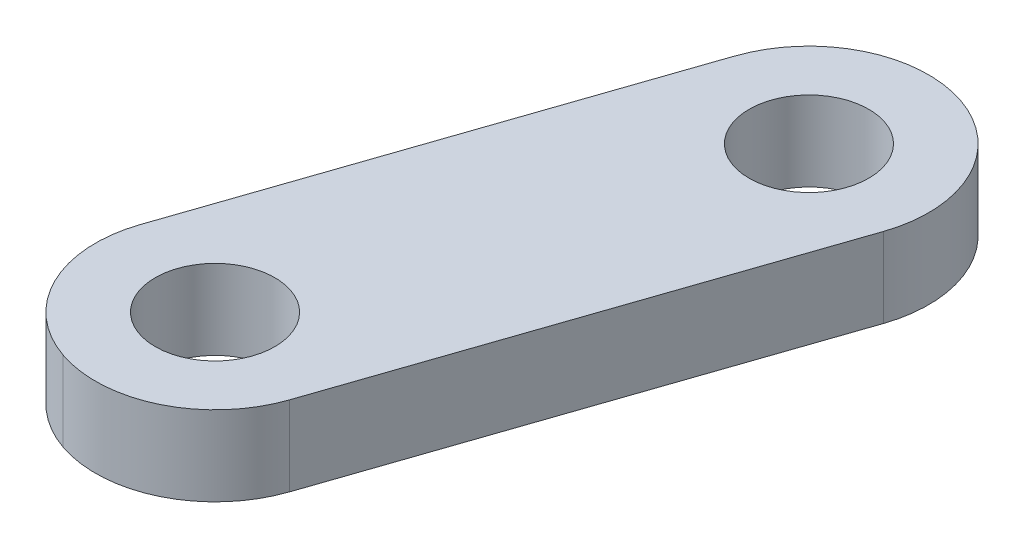
ISO-10303-21;
HEADER;
FILE_DESCRIPTION(('STEP AP214'),'2;1');
FILE_NAME('part.step','',(''),(''),'','','');
FILE_SCHEMA(('AUTOMOTIVE_DESIGN { 1 0 10303 214 1 1 1 1 }'));
ENDSEC;
DATA;
#1=APPLICATION_CONTEXT('core data for automotive mechanical design processes');
#2=APPLICATION_PROTOCOL_DEFINITION('international standard','automotive_design',2000,#1);
#3=PRODUCT_CONTEXT('',#1,'mechanical');
#4=PRODUCT('Part','Part','',(#3));
#5=PRODUCT_RELATED_PRODUCT_CATEGORY('part','',(#4));
#6=PRODUCT_DEFINITION_FORMATION('','',#4);
#7=PRODUCT_DEFINITION_CONTEXT('part definition',#1,'design');
#8=PRODUCT_DEFINITION('design','',#6,#7);
#9=PRODUCT_DEFINITION_SHAPE('','',#8);
#10=(LENGTH_UNIT() NAMED_UNIT(*) SI_UNIT(.MILLI.,.METRE.));
#11=(NAMED_UNIT(*) PLANE_ANGLE_UNIT() SI_UNIT($,.RADIAN.));
#12=(NAMED_UNIT(*) SI_UNIT($,.STERADIAN.) SOLID_ANGLE_UNIT());
#13=UNCERTAINTY_MEASURE_WITH_UNIT(LENGTH_MEASURE(1.E-05),#10,'distance_accuracy_value','');
#14=(GEOMETRIC_REPRESENTATION_CONTEXT(3) GLOBAL_UNCERTAINTY_ASSIGNED_CONTEXT((#13)) GLOBAL_UNIT_ASSIGNED_CONTEXT((#10,
#11,#12)) REPRESENTATION_CONTEXT('',''));
#15=CARTESIAN_POINT('',(0.,0.,0.));
#16=DIRECTION('',(0.,0.,1.));
#17=DIRECTION('',(1.,0.,0.));
#18=AXIS2_PLACEMENT_3D('',#15,#16,#17);
#19=CARTESIAN_POINT('',(0.,6.35,0.));
#20=DIRECTION('',(0.,1.,0.));
#21=DIRECTION('',(0.,0.,1.));
#22=AXIS2_PLACEMENT_3D('',#19,#20,#21);
#23=PLANE('',#22);
#24=CARTESIAN_POINT('',(166.123917666113,6.35,61.1988351462865));
#25=DIRECTION('',(0.,1.,0.));
#26=DIRECTION('',(0.,0.,1.));
#27=AXIS2_PLACEMENT_3D('',#24,#25,#26);
#28=CIRCLE('',#27,4.76250000000001);
#29=CARTESIAN_POINT('',(166.123917666113,6.35,65.9613351462865));
#30=VERTEX_POINT('',#29);
#31=EDGE_CURVE('E124',#30,#30,#28,.T.);
#32=ORIENTED_EDGE('',*,*,#31,.F.);
#33=EDGE_LOOP('',(#32));
#34=FACE_BOUND('',#33,.T.);
#35=CARTESIAN_POINT('',(154.091290271028,6.35,96.4608504327486));
#36=DIRECTION('',(0.,1.,0.));
#37=DIRECTION('',(0.,0.,1.));
#38=AXIS2_PLACEMENT_3D('',#35,#36,#37);
#39=CIRCLE('',#38,9.525);
#40=CARTESIAN_POINT('',(145.076677903134,6.35,93.3847508152761));
#41=VERTEX_POINT('',#40);
#42=CARTESIAN_POINT('',(151.015190653556,6.35,105.475462800643));
#43=VERTEX_POINT('',#42);
#44=EDGE_CURVE('E56',#41,#43,#39,.T.);
#45=ORIENTED_EDGE('',*,*,#44,.T.);
#46=CARTESIAN_POINT('',(154.091290271028,6.35,96.4608504327486));
#47=DIRECTION('',(0.,1.,0.));
#48=DIRECTION('',(0.,0.,1.));
#49=AXIS2_PLACEMENT_3D('',#46,#47,#48);
#50=CIRCLE('',#49,9.525);
#51=CARTESIAN_POINT('',(163.105902638922,6.35,99.5369500502211));
#52=VERTEX_POINT('',#51);
#53=EDGE_CURVE('E137',#43,#52,#50,.T.);
#54=ORIENTED_EDGE('',*,*,#53,.T.);
#55=DIRECTION('',(0.32295009107323,0.,-0.94641599662928));
#56=VECTOR('',#55,1.);
#57=CARTESIAN_POINT('',(178.21462965148,6.35,55.2603223958651));
#58=LINE('',#57,#56);
#59=CARTESIAN_POINT('',(175.138530034007,6.35,64.274934763759));
#60=VERTEX_POINT('',#59);
#61=EDGE_CURVE('E113',#52,#60,#58,.T.);
#62=ORIENTED_EDGE('',*,*,#61,.T.);
#63=CARTESIAN_POINT('',(166.123917666114,6.35,61.1988351462865));
#64=DIRECTION('',(0.,1.,0.));
#65=DIRECTION('',(0.,0.,1.));
#66=AXIS2_PLACEMENT_3D('',#63,#64,#65);
#67=CIRCLE('',#66,9.525);
#68=CARTESIAN_POINT('',(169.200017283586,6.35,52.1842227783926));
#69=VERTEX_POINT('',#68);
#70=EDGE_CURVE('E103',#60,#69,#67,.T.);
#71=ORIENTED_EDGE('',*,*,#70,.T.);
#72=CARTESIAN_POINT('',(166.123917666113,6.35,61.1988351462865));
#73=DIRECTION('',(0.,1.,0.));
#74=DIRECTION('',(0.,0.,1.));
#75=AXIS2_PLACEMENT_3D('',#72,#73,#74);
#76=CIRCLE('',#75,9.525);
#77=CARTESIAN_POINT('',(157.10930529822,6.35,58.122735528814));
#78=VERTEX_POINT('',#77);
#79=EDGE_CURVE('E134',#69,#78,#76,.T.);
#80=ORIENTED_EDGE('',*,*,#79,.T.);
#81=DIRECTION('',(-0.322950091073228,0.,0.94641599662928));
#82=VECTOR('',#81,1.);
#83=CARTESIAN_POINT('',(160.185404915692,6.35,49.10812316092));
#84=LINE('',#83,#82);
#85=EDGE_CURVE('E120',#78,#41,#84,.T.);
#86=ORIENTED_EDGE('',*,*,#85,.T.);
#87=EDGE_LOOP('',(#45,#54,#62,#71,#80,#86));
#88=FACE_BOUND('',#87,.T.);
#89=CARTESIAN_POINT('',(154.091290271028,6.35,96.4608504327486));
#90=DIRECTION('',(0.,1.,0.));
#91=DIRECTION('',(0.,0.,1.));
#92=AXIS2_PLACEMENT_3D('',#89,#90,#91);
#93=CIRCLE('',#92,4.76250000000001);
#94=CARTESIAN_POINT('',(154.091290271028,6.35,101.223350432749));
#95=VERTEX_POINT('',#94);
#96=EDGE_CURVE('E142',#95,#95,#93,.T.);
#97=ORIENTED_EDGE('',*,*,#96,.F.);
#98=EDGE_LOOP('',(#97));
#99=FACE_BOUND('',#98,.T.);
#100=ADVANCED_FACE('F39',(#34,#88,#99),#23,.T.);
#101=CARTESIAN_POINT('',(0.,0.,0.));
#102=DIRECTION('',(0.,1.,0.));
#103=DIRECTION('',(0.,0.,1.));
#104=AXIS2_PLACEMENT_3D('',#101,#102,#103);
#105=PLANE('',#104);
#106=DIRECTION('',(0.32295009107323,0.,-0.94641599662928));
#107=VECTOR('',#106,1.);
#108=CARTESIAN_POINT('',(178.21462965148,0.,55.2603223958651));
#109=LINE('',#108,#107);
#110=CARTESIAN_POINT('',(163.105902638922,0.,99.5369500502211));
#111=VERTEX_POINT('',#110);
#112=CARTESIAN_POINT('',(175.138530034007,0.,64.274934763759));
#113=VERTEX_POINT('',#112);
#114=EDGE_CURVE('E110',#111,#113,#109,.T.);
#115=ORIENTED_EDGE('',*,*,#114,.F.);
#116=CARTESIAN_POINT('',(154.091290271028,0.,96.4608504327486));
#117=DIRECTION('',(0.,1.,0.));
#118=DIRECTION('',(0.,0.,1.));
#119=AXIS2_PLACEMENT_3D('',#116,#117,#118);
#120=CIRCLE('',#119,9.525);
#121=CARTESIAN_POINT('',(151.015190653556,0.,105.475462800643));
#122=VERTEX_POINT('',#121);
#123=EDGE_CURVE('E94',#111,#122,#120,.F.);
#124=ORIENTED_EDGE('',*,*,#123,.T.);
#125=CARTESIAN_POINT('',(154.091290271028,0.,96.4608504327486));
#126=DIRECTION('',(0.,1.,0.));
#127=DIRECTION('',(0.,0.,1.));
#128=AXIS2_PLACEMENT_3D('',#125,#126,#127);
#129=CIRCLE('',#128,9.525);
#130=CARTESIAN_POINT('',(145.076677903134,0.,93.3847508152761));
#131=VERTEX_POINT('',#130);
#132=EDGE_CURVE('E104',#122,#131,#129,.F.);
#133=ORIENTED_EDGE('',*,*,#132,.T.);
#134=DIRECTION('',(-0.322950091073228,0.,0.94641599662928));
#135=VECTOR('',#134,1.);
#136=CARTESIAN_POINT('',(160.185404915692,0.,49.10812316092));
#137=LINE('',#136,#135);
#138=CARTESIAN_POINT('',(157.10930529822,0.,58.122735528814));
#139=VERTEX_POINT('',#138);
#140=EDGE_CURVE('E121',#139,#131,#137,.T.);
#141=ORIENTED_EDGE('',*,*,#140,.F.);
#142=CARTESIAN_POINT('',(166.123917666113,0.,61.1988351462865));
#143=DIRECTION('',(0.,1.,0.));
#144=DIRECTION('',(0.,0.,1.));
#145=AXIS2_PLACEMENT_3D('',#142,#143,#144);
#146=CIRCLE('',#145,9.525);
#147=CARTESIAN_POINT('',(169.200017283586,0.,52.1842227783926));
#148=VERTEX_POINT('',#147);
#149=EDGE_CURVE('E130',#139,#148,#146,.F.);
#150=ORIENTED_EDGE('',*,*,#149,.T.);
#151=CARTESIAN_POINT('',(166.123917666114,0.,61.1988351462865));
#152=DIRECTION('',(0.,1.,0.));
#153=DIRECTION('',(0.,0.,1.));
#154=AXIS2_PLACEMENT_3D('',#151,#152,#153);
#155=CIRCLE('',#154,9.525);
#156=EDGE_CURVE('E114',#148,#113,#155,.F.);
#157=ORIENTED_EDGE('',*,*,#156,.T.);
#158=EDGE_LOOP('',(#115,#124,#133,#141,#150,#157));
#159=FACE_BOUND('',#158,.T.);
#160=CARTESIAN_POINT('',(166.123917666113,0.,61.1988351462865));
#161=DIRECTION('',(0.,1.,0.));
#162=DIRECTION('',(0.,0.,1.));
#163=AXIS2_PLACEMENT_3D('',#160,#161,#162);
#164=CIRCLE('',#163,4.76250000000001);
#165=CARTESIAN_POINT('',(166.123917666113,0.,65.9613351462865));
#166=VERTEX_POINT('',#165);
#167=EDGE_CURVE('E154',#166,#166,#164,.T.);
#168=ORIENTED_EDGE('',*,*,#167,.T.);
#169=EDGE_LOOP('',(#168));
#170=FACE_BOUND('',#169,.T.);
#171=CARTESIAN_POINT('',(154.091290271028,0.,96.4608504327486));
#172=DIRECTION('',(0.,1.,0.));
#173=DIRECTION('',(0.,0.,1.));
#174=AXIS2_PLACEMENT_3D('',#171,#172,#173);
#175=CIRCLE('',#174,4.76250000000001);
#176=CARTESIAN_POINT('',(154.091290271028,0.,101.223350432749));
#177=VERTEX_POINT('',#176);
#178=EDGE_CURVE('E140',#177,#177,#175,.T.);
#179=ORIENTED_EDGE('',*,*,#178,.T.);
#180=EDGE_LOOP('',(#179));
#181=FACE_BOUND('',#180,.T.);
#182=ADVANCED_FACE('F117',(#159,#170,#181),#105,.F.);
#183=CARTESIAN_POINT('',(160.185404915692,6.35,49.10812316092));
#184=DIRECTION('',(0.94641599662928,0.,0.322950091073228));
#185=DIRECTION('',(0.322950091073228,0.,-0.94641599662928));
#186=AXIS2_PLACEMENT_3D('',#183,#184,#185);
#187=PLANE('',#186);
#188=ORIENTED_EDGE('',*,*,#140,.T.);
#189=DIRECTION('',(0.,-1.,0.));
#190=VECTOR('',#189,1.);
#191=CARTESIAN_POINT('',(145.076677903134,6.35,93.3847508152761));
#192=LINE('',#191,#190);
#193=EDGE_CURVE('E11',#131,#41,#192,.F.);
#194=ORIENTED_EDGE('',*,*,#193,.T.);
#195=ORIENTED_EDGE('',*,*,#85,.F.);
#196=DIRECTION('',(0.,-1.,0.));
#197=VECTOR('',#196,1.);
#198=CARTESIAN_POINT('',(157.10930529822,6.35,58.122735528814));
#199=LINE('',#198,#197);
#200=EDGE_CURVE('E48',#78,#139,#199,.T.);
#201=ORIENTED_EDGE('',*,*,#200,.T.);
#202=EDGE_LOOP('',(#188,#194,#195,#201));
#203=FACE_BOUND('',#202,.T.);
#204=ADVANCED_FACE('F171',(#203),#187,.F.);
#205=CARTESIAN_POINT('',(178.21462965148,6.35,55.2603223958651));
#206=DIRECTION('',(-0.94641599662928,0.,-0.32295009107323));
#207=DIRECTION('',(-0.32295009107323,0.,0.94641599662928));
#208=AXIS2_PLACEMENT_3D('',#205,#206,#207);
#209=PLANE('',#208);
#210=ORIENTED_EDGE('',*,*,#61,.F.);
#211=DIRECTION('',(0.,-1.,0.));
#212=VECTOR('',#211,1.);
#213=CARTESIAN_POINT('',(163.105902638922,6.35,99.5369500502211));
#214=LINE('',#213,#212);
#215=EDGE_CURVE('E98',#52,#111,#214,.T.);
#216=ORIENTED_EDGE('',*,*,#215,.T.);
#217=ORIENTED_EDGE('',*,*,#114,.T.);
#218=DIRECTION('',(0.,-1.,0.));
#219=VECTOR('',#218,1.);
#220=CARTESIAN_POINT('',(175.138530034007,6.35,64.274934763759));
#221=LINE('',#220,#219);
#222=EDGE_CURVE('E115',#113,#60,#221,.F.);
#223=ORIENTED_EDGE('',*,*,#222,.T.);
#224=EDGE_LOOP('',(#210,#216,#217,#223));
#225=FACE_BOUND('',#224,.T.);
#226=ADVANCED_FACE('F109',(#225),#209,.F.);
#227=CARTESIAN_POINT('',(166.123917666113,6.35,61.1988351462865));
#228=DIRECTION('',(0.,-1.,0.));
#229=DIRECTION('',(0.,0.,-1.));
#230=AXIS2_PLACEMENT_3D('',#227,#228,#229);
#231=CYLINDRICAL_SURFACE('',#230,4.76250000000001);
#232=ORIENTED_EDGE('',*,*,#31,.T.);
#233=EDGE_LOOP('',(#232));
#234=FACE_BOUND('',#233,.T.);
#235=ORIENTED_EDGE('',*,*,#167,.F.);
#236=EDGE_LOOP('',(#235));
#237=FACE_BOUND('',#236,.T.);
#238=ADVANCED_FACE('F175',(#234,#237),#231,.F.);
#239=CARTESIAN_POINT('',(154.091290271028,6.35,96.4608504327486));
#240=DIRECTION('',(0.,-1.,0.));
#241=DIRECTION('',(0.,0.,-1.));
#242=AXIS2_PLACEMENT_3D('',#239,#240,#241);
#243=CYLINDRICAL_SURFACE('',#242,4.76250000000001);
#244=ORIENTED_EDGE('',*,*,#96,.T.);
#245=EDGE_LOOP('',(#244));
#246=FACE_BOUND('',#245,.T.);
#247=ORIENTED_EDGE('',*,*,#178,.F.);
#248=EDGE_LOOP('',(#247));
#249=FACE_BOUND('',#248,.T.);
#250=ADVANCED_FACE('F162',(#246,#249),#243,.F.);
#251=CARTESIAN_POINT('',(154.091290271028,6.35,96.4608504327486));
#252=DIRECTION('',(0.,-1.,0.));
#253=DIRECTION('',(0.,0.,-1.));
#254=AXIS2_PLACEMENT_3D('',#251,#252,#253);
#255=CYLINDRICAL_SURFACE('',#254,9.525);
#256=DIRECTION('',(0.,-1.,0.));
#257=VECTOR('',#256,1.);
#258=CARTESIAN_POINT('',(151.015190653556,6.35,105.475462800643));
#259=LINE('',#258,#257);
#260=EDGE_CURVE('E99',#43,#122,#259,.T.);
#261=ORIENTED_EDGE('',*,*,#260,.F.);
#262=ORIENTED_EDGE('',*,*,#44,.F.);
#263=ORIENTED_EDGE('',*,*,#193,.F.);
#264=ORIENTED_EDGE('',*,*,#132,.F.);
#265=EDGE_LOOP('',(#261,#262,#263,#264));
#266=FACE_BOUND('',#265,.T.);
#267=ADVANCED_FACE('F184',(#266),#255,.T.);
#268=CARTESIAN_POINT('',(154.091290271028,6.35,96.4608504327486));
#269=DIRECTION('',(0.,-1.,0.));
#270=DIRECTION('',(0.,0.,-1.));
#271=AXIS2_PLACEMENT_3D('',#268,#269,#270);
#272=CYLINDRICAL_SURFACE('',#271,9.525);
#273=ORIENTED_EDGE('',*,*,#53,.F.);
#274=ORIENTED_EDGE('',*,*,#260,.T.);
#275=ORIENTED_EDGE('',*,*,#123,.F.);
#276=ORIENTED_EDGE('',*,*,#215,.F.);
#277=EDGE_LOOP('',(#273,#274,#275,#276));
#278=FACE_BOUND('',#277,.T.);
#279=ADVANCED_FACE('F97',(#278),#272,.T.);
#280=CARTESIAN_POINT('',(166.123917666114,6.35,61.1988351462865));
#281=DIRECTION('',(0.,-1.,0.));
#282=DIRECTION('',(0.,0.,-1.));
#283=AXIS2_PLACEMENT_3D('',#280,#281,#282);
#284=CYLINDRICAL_SURFACE('',#283,9.525);
#285=DIRECTION('',(0.,-1.,0.));
#286=VECTOR('',#285,1.);
#287=CARTESIAN_POINT('',(169.200017283586,6.35,52.1842227783926));
#288=LINE('',#287,#286);
#289=EDGE_CURVE('E43',#69,#148,#288,.T.);
#290=ORIENTED_EDGE('',*,*,#289,.F.);
#291=ORIENTED_EDGE('',*,*,#70,.F.);
#292=ORIENTED_EDGE('',*,*,#222,.F.);
#293=ORIENTED_EDGE('',*,*,#156,.F.);
#294=EDGE_LOOP('',(#290,#291,#292,#293));
#295=FACE_BOUND('',#294,.T.);
#296=ADVANCED_FACE('F41',(#295),#284,.T.);
#297=CARTESIAN_POINT('',(166.123917666113,6.35,61.1988351462865));
#298=DIRECTION('',(0.,-1.,0.));
#299=DIRECTION('',(0.,0.,-1.));
#300=AXIS2_PLACEMENT_3D('',#297,#298,#299);
#301=CYLINDRICAL_SURFACE('',#300,9.525);
#302=ORIENTED_EDGE('',*,*,#79,.F.);
#303=ORIENTED_EDGE('',*,*,#289,.T.);
#304=ORIENTED_EDGE('',*,*,#149,.F.);
#305=ORIENTED_EDGE('',*,*,#200,.F.);
#306=EDGE_LOOP('',(#302,#303,#304,#305));
#307=FACE_BOUND('',#306,.T.);
#308=ADVANCED_FACE('F148',(#307),#301,.T.);
#309=CLOSED_SHELL('',(#100,#182,#204,#226,#238,#250,#267,#279,#296,#308));
#310=MANIFOLD_SOLID_BREP('B2',#309);
#311=ADVANCED_BREP_SHAPE_REPRESENTATION('',(#18,#310),#14);
#312=SHAPE_DEFINITION_REPRESENTATION(#9,#311);
ENDSEC;
END-ISO-10303-21;
